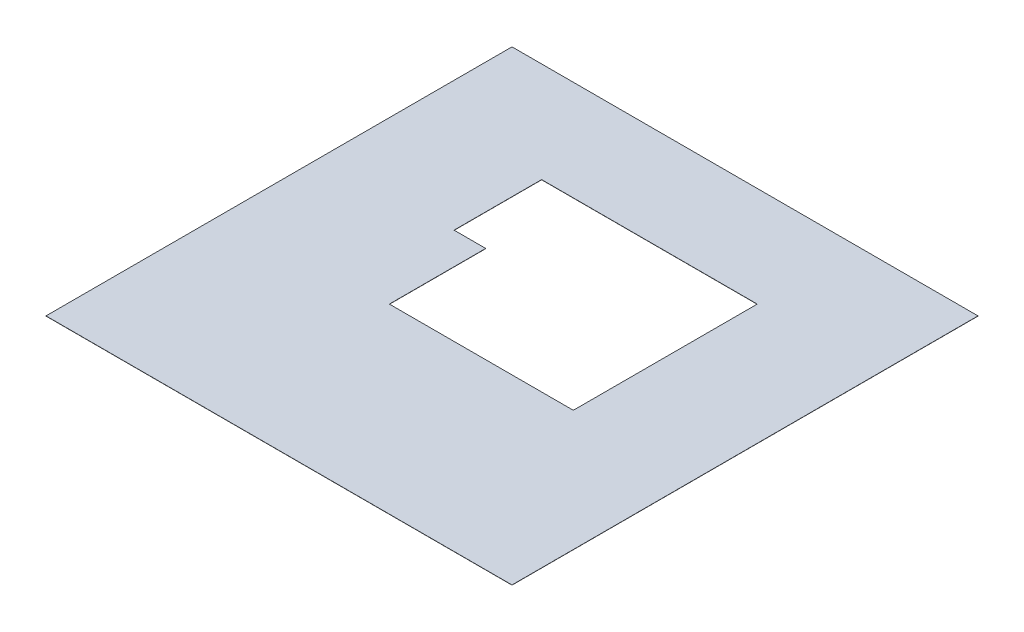
ISO-10303-21;
HEADER;
FILE_DESCRIPTION(('STEP AP214'),'2;1');
FILE_NAME('part.step','',(''),(''),'','','');
FILE_SCHEMA(('AUTOMOTIVE_DESIGN { 1 0 10303 214 1 1 1 1 }'));
ENDSEC;
DATA;
#1=APPLICATION_CONTEXT('core data for automotive mechanical design processes');
#2=APPLICATION_PROTOCOL_DEFINITION('international standard','automotive_design',2000,#1);
#3=PRODUCT_CONTEXT('',#1,'mechanical');
#4=PRODUCT('Part','Part','',(#3));
#5=PRODUCT_RELATED_PRODUCT_CATEGORY('part','',(#4));
#6=PRODUCT_DEFINITION_FORMATION('','',#4);
#7=PRODUCT_DEFINITION_CONTEXT('part definition',#1,'design');
#8=PRODUCT_DEFINITION('design','',#6,#7);
#9=PRODUCT_DEFINITION_SHAPE('','',#8);
#10=(LENGTH_UNIT() NAMED_UNIT(*) SI_UNIT(.MILLI.,.METRE.));
#11=(NAMED_UNIT(*) PLANE_ANGLE_UNIT() SI_UNIT($,.RADIAN.));
#12=(NAMED_UNIT(*) SI_UNIT($,.STERADIAN.) SOLID_ANGLE_UNIT());
#13=UNCERTAINTY_MEASURE_WITH_UNIT(LENGTH_MEASURE(1.E-05),#10,'distance_accuracy_value','');
#14=(GEOMETRIC_REPRESENTATION_CONTEXT(3) GLOBAL_UNCERTAINTY_ASSIGNED_CONTEXT((#13)) GLOBAL_UNIT_ASSIGNED_CONTEXT((#10,
#11,#12)) REPRESENTATION_CONTEXT('',''));
#15=CARTESIAN_POINT('',(0.,0.,0.));
#16=DIRECTION('',(0.,0.,1.));
#17=DIRECTION('',(1.,0.,0.));
#18=AXIS2_PLACEMENT_3D('',#15,#16,#17);
#19=CARTESIAN_POINT('',(-11400.,10.,0.));
#20=DIRECTION('',(-1.,0.,0.));
#21=DIRECTION('',(0.,0.,1.));
#22=AXIS2_PLACEMENT_3D('',#19,#20,#21);
#23=PLANE('',#22);
#24=DIRECTION('',(0.,0.,-1.));
#25=VECTOR('',#24,1.);
#26=CARTESIAN_POINT('',(-11400.,0.,0.));
#27=LINE('',#26,#25);
#28=CARTESIAN_POINT('',(-11400.,0.,11400.));
#29=VERTEX_POINT('',#28);
#30=CARTESIAN_POINT('',(-11400.,0.,-11400.));
#31=VERTEX_POINT('',#30);
#32=EDGE_CURVE('E162',#29,#31,#27,.T.);
#33=ORIENTED_EDGE('',*,*,#32,.F.);
#34=DIRECTION('',(0.,-1.,0.));
#35=VECTOR('',#34,1.);
#36=CARTESIAN_POINT('',(-11400.,10.,11400.));
#37=LINE('',#36,#35);
#38=CARTESIAN_POINT('',(-11400.,10.,11400.));
#39=VERTEX_POINT('',#38);
#40=EDGE_CURVE('E11',#39,#29,#37,.T.);
#41=ORIENTED_EDGE('',*,*,#40,.F.);
#42=DIRECTION('',(0.,0.,-1.));
#43=VECTOR('',#42,1.);
#44=CARTESIAN_POINT('',(-11400.,10.,0.));
#45=LINE('',#44,#43);
#46=CARTESIAN_POINT('',(-11400.,10.,-11400.));
#47=VERTEX_POINT('',#46);
#48=EDGE_CURVE('E130',#39,#47,#45,.T.);
#49=ORIENTED_EDGE('',*,*,#48,.T.);
#50=DIRECTION('',(0.,-1.,0.));
#51=VECTOR('',#50,1.);
#52=CARTESIAN_POINT('',(-11400.,10.,-11400.));
#53=LINE('',#52,#51);
#54=EDGE_CURVE('E52',#47,#31,#53,.T.);
#55=ORIENTED_EDGE('',*,*,#54,.T.);
#56=EDGE_LOOP('',(#33,#41,#49,#55));
#57=FACE_BOUND('',#56,.T.);
#58=ADVANCED_FACE('F33',(#57),#23,.T.);
#59=CARTESIAN_POINT('',(0.,10.,11400.));
#60=DIRECTION('',(0.,0.,-1.));
#61=DIRECTION('',(-1.,0.,0.));
#62=AXIS2_PLACEMENT_3D('',#59,#60,#61);
#63=PLANE('',#62);
#64=DIRECTION('',(1.,0.,0.));
#65=VECTOR('',#64,1.);
#66=CARTESIAN_POINT('',(0.,0.,11400.));
#67=LINE('',#66,#65);
#68=CARTESIAN_POINT('',(11400.,0.,11400.));
#69=VERTEX_POINT('',#68);
#70=EDGE_CURVE('E135',#29,#69,#67,.T.);
#71=ORIENTED_EDGE('',*,*,#70,.T.);
#72=DIRECTION('',(0.,-1.,0.));
#73=VECTOR('',#72,1.);
#74=CARTESIAN_POINT('',(11400.,10.,11400.));
#75=LINE('',#74,#73);
#76=CARTESIAN_POINT('',(11400.,10.,11400.));
#77=VERTEX_POINT('',#76);
#78=EDGE_CURVE('E43',#77,#69,#75,.T.);
#79=ORIENTED_EDGE('',*,*,#78,.F.);
#80=DIRECTION('',(1.,0.,0.));
#81=VECTOR('',#80,1.);
#82=CARTESIAN_POINT('',(0.,10.,11400.));
#83=LINE('',#82,#81);
#84=EDGE_CURVE('E125',#39,#77,#83,.T.);
#85=ORIENTED_EDGE('',*,*,#84,.F.);
#86=ORIENTED_EDGE('',*,*,#40,.T.);
#87=EDGE_LOOP('',(#71,#79,#85,#86));
#88=FACE_BOUND('',#87,.T.);
#89=ADVANCED_FACE('F133',(#88),#63,.F.);
#90=CARTESIAN_POINT('',(11400.,10.,8.88178419700125E-13));
#91=DIRECTION('',(-1.,0.,0.));
#92=DIRECTION('',(0.,0.,1.));
#93=AXIS2_PLACEMENT_3D('',#90,#91,#92);
#94=PLANE('',#93);
#95=DIRECTION('',(0.,0.,-1.));
#96=VECTOR('',#95,1.);
#97=CARTESIAN_POINT('',(11400.,0.,8.88178419700125E-13));
#98=LINE('',#97,#96);
#99=CARTESIAN_POINT('',(11400.,0.,-11400.));
#100=VERTEX_POINT('',#99);
#101=EDGE_CURVE('E159',#69,#100,#98,.T.);
#102=ORIENTED_EDGE('',*,*,#101,.T.);
#103=DIRECTION('',(0.,-1.,0.));
#104=VECTOR('',#103,1.);
#105=CARTESIAN_POINT('',(11400.,10.,-11400.));
#106=LINE('',#105,#104);
#107=CARTESIAN_POINT('',(11400.,10.,-11400.));
#108=VERTEX_POINT('',#107);
#109=EDGE_CURVE('E84',#108,#100,#106,.T.);
#110=ORIENTED_EDGE('',*,*,#109,.F.);
#111=DIRECTION('',(0.,0.,-1.));
#112=VECTOR('',#111,1.);
#113=CARTESIAN_POINT('',(11400.,10.,8.88178419700125E-13));
#114=LINE('',#113,#112);
#115=EDGE_CURVE('E117',#77,#108,#114,.T.);
#116=ORIENTED_EDGE('',*,*,#115,.F.);
#117=ORIENTED_EDGE('',*,*,#78,.T.);
#118=EDGE_LOOP('',(#102,#110,#116,#117));
#119=FACE_BOUND('',#118,.T.);
#120=ADVANCED_FACE('F119',(#119),#94,.F.);
#121=CARTESIAN_POINT('',(0.,10.,2500.));
#122=DIRECTION('',(0.,0.,-1.));
#123=DIRECTION('',(-1.,0.,0.));
#124=AXIS2_PLACEMENT_3D('',#121,#122,#123);
#125=PLANE('',#124);
#126=DIRECTION('',(1.,0.,0.));
#127=VECTOR('',#126,1.);
#128=CARTESIAN_POINT('',(0.,0.,2500.));
#129=LINE('',#128,#127);
#130=CARTESIAN_POINT('',(-3500.,0.,2500.));
#131=VERTEX_POINT('',#130);
#132=CARTESIAN_POINT('',(5500.,0.,2500.));
#133=VERTEX_POINT('',#132);
#134=EDGE_CURVE('E179',#131,#133,#129,.T.);
#135=ORIENTED_EDGE('',*,*,#134,.F.);
#136=DIRECTION('',(0.,-1.,0.));
#137=VECTOR('',#136,1.);
#138=CARTESIAN_POINT('',(-3500.,10.,2500.));
#139=LINE('',#138,#137);
#140=CARTESIAN_POINT('',(-3500.,10.,2500.));
#141=VERTEX_POINT('',#140);
#142=EDGE_CURVE('E37',#141,#131,#139,.T.);
#143=ORIENTED_EDGE('',*,*,#142,.F.);
#144=DIRECTION('',(1.,0.,0.));
#145=VECTOR('',#144,1.);
#146=CARTESIAN_POINT('',(0.,10.,2500.));
#147=LINE('',#146,#145);
#148=CARTESIAN_POINT('',(5500.,10.,2500.));
#149=VERTEX_POINT('',#148);
#150=EDGE_CURVE('E158',#141,#149,#147,.T.);
#151=ORIENTED_EDGE('',*,*,#150,.T.);
#152=DIRECTION('',(0.,-1.,0.));
#153=VECTOR('',#152,1.);
#154=CARTESIAN_POINT('',(5500.,10.,2500.));
#155=LINE('',#154,#153);
#156=EDGE_CURVE('E140',#149,#133,#155,.T.);
#157=ORIENTED_EDGE('',*,*,#156,.T.);
#158=EDGE_LOOP('',(#135,#143,#151,#157));
#159=FACE_BOUND('',#158,.T.);
#160=ADVANCED_FACE('F35',(#159),#125,.T.);
#161=CARTESIAN_POINT('',(-3500.,10.,6.59305295641663E-13));
#162=DIRECTION('',(1.,0.,0.));
#163=DIRECTION('',(0.,0.,-1.));
#164=AXIS2_PLACEMENT_3D('',#161,#162,#163);
#165=PLANE('',#164);
#166=DIRECTION('',(0.,0.,1.));
#167=VECTOR('',#166,1.);
#168=CARTESIAN_POINT('',(-3500.,0.,6.59305295641663E-13));
#169=LINE('',#168,#167);
#170=CARTESIAN_POINT('',(-3500.,0.,-2215.));
#171=VERTEX_POINT('',#170);
#172=EDGE_CURVE('E176',#171,#131,#169,.T.);
#173=ORIENTED_EDGE('',*,*,#172,.F.);
#174=DIRECTION('',(0.,-1.,0.));
#175=VECTOR('',#174,1.);
#176=CARTESIAN_POINT('',(-3500.,10.,-2215.));
#177=LINE('',#176,#175);
#178=CARTESIAN_POINT('',(-3500.,10.,-2215.));
#179=VERTEX_POINT('',#178);
#180=EDGE_CURVE('E147',#179,#171,#177,.T.);
#181=ORIENTED_EDGE('',*,*,#180,.F.);
#182=DIRECTION('',(0.,0.,1.));
#183=VECTOR('',#182,1.);
#184=CARTESIAN_POINT('',(-3500.,10.,6.59305295641663E-13));
#185=LINE('',#184,#183);
#186=EDGE_CURVE('E195',#179,#141,#185,.T.);
#187=ORIENTED_EDGE('',*,*,#186,.T.);
#188=ORIENTED_EDGE('',*,*,#142,.T.);
#189=EDGE_LOOP('',(#173,#181,#187,#188));
#190=FACE_BOUND('',#189,.T.);
#191=ADVANCED_FACE('F209',(#190),#165,.T.);
#192=CARTESIAN_POINT('',(0.,10.,-2215.));
#193=DIRECTION('',(0.,0.,-1.));
#194=DIRECTION('',(-1.,0.,0.));
#195=AXIS2_PLACEMENT_3D('',#192,#193,#194);
#196=PLANE('',#195);
#197=DIRECTION('',(1.,0.,0.));
#198=VECTOR('',#197,1.);
#199=CARTESIAN_POINT('',(0.,0.,-2215.));
#200=LINE('',#199,#198);
#201=CARTESIAN_POINT('',(-5050.,0.,-2215.));
#202=VERTEX_POINT('',#201);
#203=EDGE_CURVE('E173',#202,#171,#200,.T.);
#204=ORIENTED_EDGE('',*,*,#203,.F.);
#205=DIRECTION('',(0.,-1.,0.));
#206=VECTOR('',#205,1.);
#207=CARTESIAN_POINT('',(-5050.,10.,-2215.));
#208=LINE('',#207,#206);
#209=CARTESIAN_POINT('',(-5050.,10.,-2215.));
#210=VERTEX_POINT('',#209);
#211=EDGE_CURVE('E146',#210,#202,#208,.T.);
#212=ORIENTED_EDGE('',*,*,#211,.F.);
#213=DIRECTION('',(1.,0.,0.));
#214=VECTOR('',#213,1.);
#215=CARTESIAN_POINT('',(0.,10.,-2215.));
#216=LINE('',#215,#214);
#217=EDGE_CURVE('E193',#210,#179,#216,.T.);
#218=ORIENTED_EDGE('',*,*,#217,.T.);
#219=ORIENTED_EDGE('',*,*,#180,.T.);
#220=EDGE_LOOP('',(#204,#212,#218,#219));
#221=FACE_BOUND('',#220,.T.);
#222=ADVANCED_FACE('F211',(#221),#196,.T.);
#223=CARTESIAN_POINT('',(-5050.,10.,1.0467446953292E-12));
#224=DIRECTION('',(1.,0.,0.));
#225=DIRECTION('',(0.,0.,-1.));
#226=AXIS2_PLACEMENT_3D('',#223,#224,#225);
#227=PLANE('',#226);
#228=DIRECTION('',(0.,0.,1.));
#229=VECTOR('',#228,1.);
#230=CARTESIAN_POINT('',(-5050.,0.,1.0467446953292E-12));
#231=LINE('',#230,#229);
#232=CARTESIAN_POINT('',(-5050.,0.,-6500.));
#233=VERTEX_POINT('',#232);
#234=EDGE_CURVE('E170',#233,#202,#231,.T.);
#235=ORIENTED_EDGE('',*,*,#234,.F.);
#236=DIRECTION('',(0.,-1.,0.));
#237=VECTOR('',#236,1.);
#238=CARTESIAN_POINT('',(-5050.,10.,-6500.));
#239=LINE('',#238,#237);
#240=CARTESIAN_POINT('',(-5050.,10.,-6500.));
#241=VERTEX_POINT('',#240);
#242=EDGE_CURVE('E144',#241,#233,#239,.T.);
#243=ORIENTED_EDGE('',*,*,#242,.F.);
#244=DIRECTION('',(0.,0.,1.));
#245=VECTOR('',#244,1.);
#246=CARTESIAN_POINT('',(-5050.,10.,1.0467446953292E-12));
#247=LINE('',#246,#245);
#248=EDGE_CURVE('E190',#241,#210,#247,.T.);
#249=ORIENTED_EDGE('',*,*,#248,.T.);
#250=ORIENTED_EDGE('',*,*,#211,.T.);
#251=EDGE_LOOP('',(#235,#243,#249,#250));
#252=FACE_BOUND('',#251,.T.);
#253=ADVANCED_FACE('F214',(#252),#227,.T.);
#254=CARTESIAN_POINT('',(0.,10.,-6500.));
#255=DIRECTION('',(0.,0.,1.));
#256=DIRECTION('',(1.,0.,0.));
#257=AXIS2_PLACEMENT_3D('',#254,#255,#256);
#258=PLANE('',#257);
#259=DIRECTION('',(-1.,0.,0.));
#260=VECTOR('',#259,1.);
#261=CARTESIAN_POINT('',(0.,0.,-6500.));
#262=LINE('',#261,#260);
#263=CARTESIAN_POINT('',(5500.,0.,-6500.));
#264=VERTEX_POINT('',#263);
#265=EDGE_CURVE('E167',#264,#233,#262,.T.);
#266=ORIENTED_EDGE('',*,*,#265,.F.);
#267=DIRECTION('',(0.,-1.,0.));
#268=VECTOR('',#267,1.);
#269=CARTESIAN_POINT('',(5500.,10.,-6500.));
#270=LINE('',#269,#268);
#271=CARTESIAN_POINT('',(5500.,10.,-6500.));
#272=VERTEX_POINT('',#271);
#273=EDGE_CURVE('E142',#272,#264,#270,.T.);
#274=ORIENTED_EDGE('',*,*,#273,.F.);
#275=DIRECTION('',(-1.,0.,0.));
#276=VECTOR('',#275,1.);
#277=CARTESIAN_POINT('',(0.,10.,-6500.));
#278=LINE('',#277,#276);
#279=EDGE_CURVE('E187',#272,#241,#278,.T.);
#280=ORIENTED_EDGE('',*,*,#279,.T.);
#281=ORIENTED_EDGE('',*,*,#242,.T.);
#282=EDGE_LOOP('',(#266,#274,#280,#281));
#283=FACE_BOUND('',#282,.T.);
#284=ADVANCED_FACE('F216',(#283),#258,.T.);
#285=CARTESIAN_POINT('',(5500.,10.,0.));
#286=DIRECTION('',(-1.,0.,0.));
#287=DIRECTION('',(0.,0.,1.));
#288=AXIS2_PLACEMENT_3D('',#285,#286,#287);
#289=PLANE('',#288);
#290=DIRECTION('',(0.,0.,-1.));
#291=VECTOR('',#290,1.);
#292=CARTESIAN_POINT('',(5500.,0.,0.));
#293=LINE('',#292,#291);
#294=EDGE_CURVE('E164',#133,#264,#293,.T.);
#295=ORIENTED_EDGE('',*,*,#294,.F.);
#296=ORIENTED_EDGE('',*,*,#156,.F.);
#297=DIRECTION('',(0.,0.,-1.));
#298=VECTOR('',#297,1.);
#299=CARTESIAN_POINT('',(5500.,10.,0.));
#300=LINE('',#299,#298);
#301=EDGE_CURVE('E184',#149,#272,#300,.T.);
#302=ORIENTED_EDGE('',*,*,#301,.T.);
#303=ORIENTED_EDGE('',*,*,#273,.T.);
#304=EDGE_LOOP('',(#295,#296,#302,#303));
#305=FACE_BOUND('',#304,.T.);
#306=ADVANCED_FACE('F204',(#305),#289,.T.);
#307=CARTESIAN_POINT('',(8.88178419700125E-13,10.,-11400.));
#308=DIRECTION('',(0.,0.,-1.));
#309=DIRECTION('',(-1.,0.,0.));
#310=AXIS2_PLACEMENT_3D('',#307,#308,#309);
#311=PLANE('',#310);
#312=DIRECTION('',(1.,0.,0.));
#313=VECTOR('',#312,1.);
#314=CARTESIAN_POINT('',(8.88178419700125E-13,0.,-11400.));
#315=LINE('',#314,#313);
#316=EDGE_CURVE('E155',#31,#100,#315,.T.);
#317=ORIENTED_EDGE('',*,*,#316,.F.);
#318=ORIENTED_EDGE('',*,*,#54,.F.);
#319=DIRECTION('',(1.,0.,0.));
#320=VECTOR('',#319,1.);
#321=CARTESIAN_POINT('',(8.88178419700125E-13,10.,-11400.));
#322=LINE('',#321,#320);
#323=EDGE_CURVE('E124',#47,#108,#322,.T.);
#324=ORIENTED_EDGE('',*,*,#323,.T.);
#325=ORIENTED_EDGE('',*,*,#109,.T.);
#326=EDGE_LOOP('',(#317,#318,#324,#325));
#327=FACE_BOUND('',#326,.T.);
#328=ADVANCED_FACE('F223',(#327),#311,.T.);
#329=CARTESIAN_POINT('',(0.,10.,0.));
#330=DIRECTION('',(0.,1.,0.));
#331=DIRECTION('',(0.,0.,1.));
#332=AXIS2_PLACEMENT_3D('',#329,#330,#331);
#333=PLANE('',#332);
#334=ORIENTED_EDGE('',*,*,#150,.F.);
#335=ORIENTED_EDGE('',*,*,#186,.F.);
#336=ORIENTED_EDGE('',*,*,#217,.F.);
#337=ORIENTED_EDGE('',*,*,#248,.F.);
#338=ORIENTED_EDGE('',*,*,#279,.F.);
#339=ORIENTED_EDGE('',*,*,#301,.F.);
#340=EDGE_LOOP('',(#334,#335,#336,#337,#338,#339));
#341=FACE_BOUND('',#340,.T.);
#342=ORIENTED_EDGE('',*,*,#48,.F.);
#343=ORIENTED_EDGE('',*,*,#84,.T.);
#344=ORIENTED_EDGE('',*,*,#115,.T.);
#345=ORIENTED_EDGE('',*,*,#323,.F.);
#346=EDGE_LOOP('',(#342,#343,#344,#345));
#347=FACE_BOUND('',#346,.T.);
#348=ADVANCED_FACE('F129',(#341,#347),#333,.T.);
#349=CARTESIAN_POINT('',(0.,0.,0.));
#350=DIRECTION('',(0.,1.,0.));
#351=DIRECTION('',(0.,0.,1.));
#352=AXIS2_PLACEMENT_3D('',#349,#350,#351);
#353=PLANE('',#352);
#354=ORIENTED_EDGE('',*,*,#134,.T.);
#355=ORIENTED_EDGE('',*,*,#294,.T.);
#356=ORIENTED_EDGE('',*,*,#265,.T.);
#357=ORIENTED_EDGE('',*,*,#234,.T.);
#358=ORIENTED_EDGE('',*,*,#203,.T.);
#359=ORIENTED_EDGE('',*,*,#172,.T.);
#360=EDGE_LOOP('',(#354,#355,#356,#357,#358,#359));
#361=FACE_BOUND('',#360,.T.);
#362=ORIENTED_EDGE('',*,*,#32,.T.);
#363=ORIENTED_EDGE('',*,*,#316,.T.);
#364=ORIENTED_EDGE('',*,*,#101,.F.);
#365=ORIENTED_EDGE('',*,*,#70,.F.);
#366=EDGE_LOOP('',(#362,#363,#364,#365));
#367=FACE_BOUND('',#366,.T.);
#368=ADVANCED_FACE('F207',(#361,#367),#353,.F.);
#369=CLOSED_SHELL('',(#58,#89,#120,#160,#191,#222,#253,#284,#306,#328,#348,#368));
#370=MANIFOLD_SOLID_BREP('B2',#369);
#371=ADVANCED_BREP_SHAPE_REPRESENTATION('',(#18,#370),#14);
#372=SHAPE_DEFINITION_REPRESENTATION(#9,#371);
ENDSEC;
END-ISO-10303-21;
